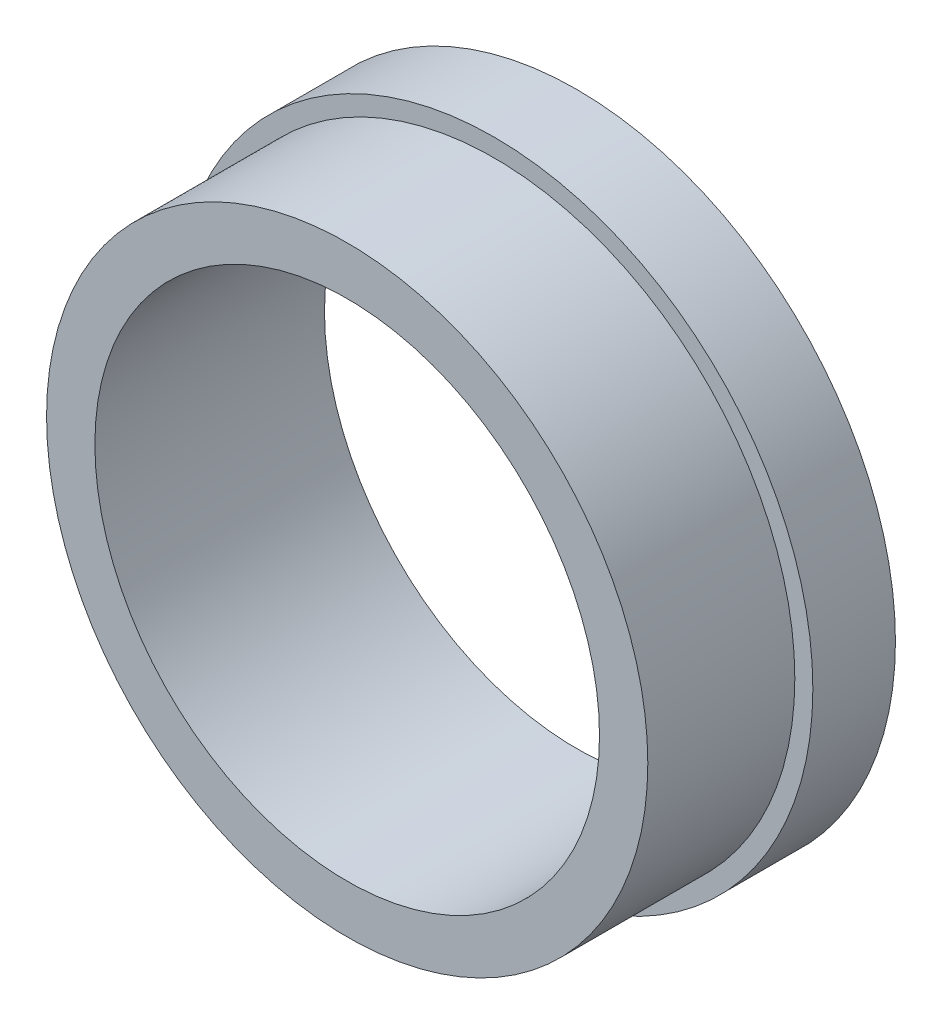
ISO-10303-21;
HEADER;
FILE_DESCRIPTION(('STEP AP214'),'2;1');
FILE_NAME('part.step','',(''),(''),'','','');
FILE_SCHEMA(('AUTOMOTIVE_DESIGN { 1 0 10303 214 1 1 1 1 }'));
ENDSEC;
DATA;
#1=APPLICATION_CONTEXT('core data for automotive mechanical design processes');
#2=APPLICATION_PROTOCOL_DEFINITION('international standard','automotive_design',2000,#1);
#3=PRODUCT_CONTEXT('',#1,'mechanical');
#4=PRODUCT('Part','Part','',(#3));
#5=PRODUCT_RELATED_PRODUCT_CATEGORY('part','',(#4));
#6=PRODUCT_DEFINITION_FORMATION('','',#4);
#7=PRODUCT_DEFINITION_CONTEXT('part definition',#1,'design');
#8=PRODUCT_DEFINITION('design','',#6,#7);
#9=PRODUCT_DEFINITION_SHAPE('','',#8);
#10=(LENGTH_UNIT() NAMED_UNIT(*) SI_UNIT(.MILLI.,.METRE.));
#11=(NAMED_UNIT(*) PLANE_ANGLE_UNIT() SI_UNIT($,.RADIAN.));
#12=(NAMED_UNIT(*) SI_UNIT($,.STERADIAN.) SOLID_ANGLE_UNIT());
#13=UNCERTAINTY_MEASURE_WITH_UNIT(LENGTH_MEASURE(1.E-05),#10,'distance_accuracy_value','');
#14=(GEOMETRIC_REPRESENTATION_CONTEXT(3) GLOBAL_UNCERTAINTY_ASSIGNED_CONTEXT((#13)) GLOBAL_UNIT_ASSIGNED_CONTEXT((#10,
#11,#12)) REPRESENTATION_CONTEXT('',''));
#15=CARTESIAN_POINT('',(0.,0.,0.));
#16=DIRECTION('',(0.,0.,1.));
#17=DIRECTION('',(1.,0.,0.));
#18=AXIS2_PLACEMENT_3D('',#15,#16,#17);
#19=CARTESIAN_POINT('',(0.,0.,35.306));
#20=DIRECTION('',(0.,0.,1.));
#21=DIRECTION('',(1.,0.,0.));
#22=AXIS2_PLACEMENT_3D('',#19,#20,#21);
#23=PLANE('',#22);
#24=CARTESIAN_POINT('',(0.,0.,35.306));
#25=DIRECTION('',(0.,0.,1.));
#26=DIRECTION('',(1.,0.,0.));
#27=AXIS2_PLACEMENT_3D('',#24,#25,#26);
#28=CIRCLE('',#27,38.7985);
#29=CARTESIAN_POINT('',(-38.7985,0.,35.306));
#30=VERTEX_POINT('',#29);
#31=EDGE_CURVE('E43',#30,#30,#28,.T.);
#32=ORIENTED_EDGE('',*,*,#31,.F.);
#33=EDGE_LOOP('',(#32));
#34=FACE_BOUND('',#33,.T.);
#35=CARTESIAN_POINT('',(0.,0.,35.306));
#36=DIRECTION('',(0.,0.,1.));
#37=DIRECTION('',(1.,0.,0.));
#38=AXIS2_PLACEMENT_3D('',#35,#36,#37);
#39=CIRCLE('',#38,46.228);
#40=CARTESIAN_POINT('',(46.228,0.,35.306));
#41=VERTEX_POINT('',#40);
#42=EDGE_CURVE('E54',#41,#41,#39,.T.);
#43=ORIENTED_EDGE('',*,*,#42,.T.);
#44=EDGE_LOOP('',(#43));
#45=FACE_BOUND('',#44,.T.);
#46=ADVANCED_FACE('F35',(#34,#45),#23,.T.);
#47=CARTESIAN_POINT('',(0.,0.,35.306));
#48=DIRECTION('',(0.,0.,-1.));
#49=DIRECTION('',(-1.,0.,0.));
#50=AXIS2_PLACEMENT_3D('',#47,#48,#49);
#51=CYLINDRICAL_SURFACE('',#50,49.);
#52=CARTESIAN_POINT('',(0.,0.,0.));
#53=DIRECTION('',(0.,0.,1.));
#54=DIRECTION('',(1.,0.,0.));
#55=AXIS2_PLACEMENT_3D('',#52,#53,#54);
#56=CIRCLE('',#55,49.);
#57=CARTESIAN_POINT('',(-49.,0.,0.));
#58=VERTEX_POINT('',#57);
#59=EDGE_CURVE('E11',#58,#58,#56,.T.);
#60=CARTESIAN_POINT('',(0.,0.,12.7));
#61=DIRECTION('',(0.,0.,1.));
#62=DIRECTION('',(1.,0.,0.));
#63=AXIS2_PLACEMENT_3D('',#60,#61,#62);
#64=CIRCLE('',#63,49.);
#65=CARTESIAN_POINT('',(-49.,0.,12.7));
#66=VERTEX_POINT('',#65);
#67=EDGE_CURVE('E39',#66,#66,#64,.T.);
#68=CARTESIAN_POINT('',(-49.,0.,0.));
#69=CARTESIAN_POINT('',(-49.,0.,0.132291666666666));
#70=CARTESIAN_POINT('',(-49.,0.,0.264583333333332));
#71=CARTESIAN_POINT('',(-49.,0.,0.529166666666666));
#72=CARTESIAN_POINT('',(-49.,0.,0.661458333333334));
#73=CARTESIAN_POINT('',(-49.,0.,0.926041666666669));
#74=CARTESIAN_POINT('',(-49.,0.,1.05833333333333));
#75=CARTESIAN_POINT('',(-49.,0.,1.32291666666667));
#76=CARTESIAN_POINT('',(-49.,0.,1.45520833333333));
#77=CARTESIAN_POINT('',(-49.,0.,1.71979166666667));
#78=CARTESIAN_POINT('',(-49.,0.,1.85208333333334));
#79=CARTESIAN_POINT('',(-49.,0.,2.11666666666667));
#80=CARTESIAN_POINT('',(-49.,0.,2.24895833333334));
#81=CARTESIAN_POINT('',(-49.,0.,2.51354166666667));
#82=CARTESIAN_POINT('',(-49.,0.,2.64583333333333));
#83=CARTESIAN_POINT('',(-49.,0.,2.91041666666667));
#84=CARTESIAN_POINT('',(-49.,0.,3.04270833333333));
#85=CARTESIAN_POINT('',(-49.,0.,3.30729166666667));
#86=CARTESIAN_POINT('',(-49.,0.,3.43958333333333));
#87=CARTESIAN_POINT('',(-49.,0.,3.70416666666667));
#88=CARTESIAN_POINT('',(-49.,0.,3.83645833333333));
#89=CARTESIAN_POINT('',(-49.,0.,4.10104166666667));
#90=CARTESIAN_POINT('',(-49.,0.,4.23333333333333));
#91=CARTESIAN_POINT('',(-49.,0.,4.49791666666667));
#92=CARTESIAN_POINT('',(-49.,0.,4.63020833333333));
#93=CARTESIAN_POINT('',(-49.,0.,4.89479166666667));
#94=CARTESIAN_POINT('',(-49.,0.,5.02708333333333));
#95=CARTESIAN_POINT('',(-49.,0.,5.29166666666666));
#96=CARTESIAN_POINT('',(-49.,0.,5.42395833333333));
#97=CARTESIAN_POINT('',(-49.,0.,5.68854166666667));
#98=CARTESIAN_POINT('',(-49.,0.,5.82083333333333));
#99=CARTESIAN_POINT('',(-49.,0.,6.08541666666667));
#100=CARTESIAN_POINT('',(-49.,0.,6.21770833333333));
#101=CARTESIAN_POINT('',(-49.,0.,6.48229166666666));
#102=CARTESIAN_POINT('',(-49.,0.,6.61458333333333));
#103=CARTESIAN_POINT('',(-49.,0.,6.87916666666666));
#104=CARTESIAN_POINT('',(-49.,0.,7.01145833333333));
#105=CARTESIAN_POINT('',(-49.,0.,7.27604166666666));
#106=CARTESIAN_POINT('',(-49.,0.,7.40833333333333));
#107=CARTESIAN_POINT('',(-49.,0.,7.67291666666666));
#108=CARTESIAN_POINT('',(-49.,0.,7.80520833333333));
#109=CARTESIAN_POINT('',(-49.,0.,8.06979166666666));
#110=CARTESIAN_POINT('',(-49.,0.,8.20208333333333));
#111=CARTESIAN_POINT('',(-49.,0.,8.46666666666667));
#112=CARTESIAN_POINT('',(-49.,0.,8.59895833333333));
#113=CARTESIAN_POINT('',(-49.,0.,8.86354166666666));
#114=CARTESIAN_POINT('',(-49.,0.,8.99583333333333));
#115=CARTESIAN_POINT('',(-49.,0.,9.26041666666666));
#116=CARTESIAN_POINT('',(-49.,0.,9.39270833333333));
#117=CARTESIAN_POINT('',(-49.,0.,9.65729166666667));
#118=CARTESIAN_POINT('',(-49.,0.,9.78958333333333));
#119=CARTESIAN_POINT('',(-49.,0.,10.0541666666667));
#120=CARTESIAN_POINT('',(-49.,0.,10.1864583333333));
#121=CARTESIAN_POINT('',(-49.,0.,10.4510416666667));
#122=CARTESIAN_POINT('',(-49.,0.,10.5833333333333));
#123=CARTESIAN_POINT('',(-49.,0.,10.8479166666667));
#124=CARTESIAN_POINT('',(-49.,0.,10.9802083333333));
#125=CARTESIAN_POINT('',(-49.,0.,11.2447916666667));
#126=CARTESIAN_POINT('',(-49.,0.,11.3770833333333));
#127=CARTESIAN_POINT('',(-49.,0.,11.6416666666667));
#128=CARTESIAN_POINT('',(-49.,0.,11.7739583333333));
#129=CARTESIAN_POINT('',(-49.,0.,12.0385416666667));
#130=CARTESIAN_POINT('',(-49.,0.,12.1708333333333));
#131=CARTESIAN_POINT('',(-49.,0.,12.4354166666667));
#132=CARTESIAN_POINT('',(-49.,0.,12.5677083333333));
#133=CARTESIAN_POINT('',(-49.,0.,12.7));
#134=B_SPLINE_CURVE_WITH_KNOTS('',3,(#68,#69,#70,#71,#72,#73,#74,#75,#76,#77,#78,#79,#80,#81,
#82,#83,#84,#85,#86,#87,#88,#89,#90,#91,#92,#93,#94,#95,#96,#97,#98,#99,#100,#101,#102,#103,
#104,#105,#106,#107,#108,#109,#110,#111,#112,#113,#114,#115,#116,#117,#118,#119,#120,#121,#122,
#123,#124,#125,#126,#127,#128,#129,#130,#131,#132,#133),.UNSPECIFIED.,.F.,.F.,(4,2,2,2,2,2,2,2,
2,2,2,2,2,2,2,2,2,2,2,2,2,2,2,2,2,2,2,2,2,2,2,2,4),(0.,0.396874999999998,0.793750000000003,
1.190625,1.5875,1.984375,2.38125,2.778125,3.175,3.571875,3.96875,4.365625,4.7625,5.159375,
5.55625,5.953125,6.35,6.746875,7.14375,7.540625,7.9375,8.334375,8.73125,9.128125,9.525,9.921875,
10.31875,10.715625,11.1125,11.509375,11.90625,12.303125,12.7),.UNSPECIFIED.);
#135=EDGE_CURVE('BSEAM37',#58,#66,#134,.T.);
#136=ORIENTED_EDGE('',*,*,#59,.T.);
#137=ORIENTED_EDGE('',*,*,#67,.F.);
#138=ORIENTED_EDGE('',*,*,#135,.T.);
#139=ORIENTED_EDGE('',*,*,#135,.F.);
#140=EDGE_LOOP('',(#136,#138,#137,#139));
#141=FACE_BOUND('',#140,.T.);
#142=ADVANCED_FACE('F37',(#141),#51,.T.);
#143=CARTESIAN_POINT('',(0.,0.,0.));
#144=DIRECTION('',(0.,0.,1.));
#145=DIRECTION('',(1.,0.,0.));
#146=AXIS2_PLACEMENT_3D('',#143,#144,#145);
#147=PLANE('',#146);
#148=ORIENTED_EDGE('',*,*,#59,.F.);
#149=EDGE_LOOP('',(#148));
#150=FACE_BOUND('',#149,.T.);
#151=CARTESIAN_POINT('',(0.,0.,0.));
#152=DIRECTION('',(0.,0.,1.));
#153=DIRECTION('',(1.,0.,0.));
#154=AXIS2_PLACEMENT_3D('',#151,#152,#153);
#155=CIRCLE('',#154,38.7985);
#156=CARTESIAN_POINT('',(-38.7985,0.,0.));
#157=VERTEX_POINT('',#156);
#158=EDGE_CURVE('E48',#157,#157,#155,.T.);
#159=ORIENTED_EDGE('',*,*,#158,.T.);
#160=EDGE_LOOP('',(#159));
#161=FACE_BOUND('',#160,.T.);
#162=ADVANCED_FACE('F69',(#150,#161),#147,.F.);
#163=CARTESIAN_POINT('',(0.,0.,35.306));
#164=DIRECTION('',(0.,0.,-1.));
#165=DIRECTION('',(-1.,0.,0.));
#166=AXIS2_PLACEMENT_3D('',#163,#164,#165);
#167=CYLINDRICAL_SURFACE('',#166,38.7985);
#168=CARTESIAN_POINT('',(-38.7985,0.,35.306));
#169=CARTESIAN_POINT('',(-38.7985,0.,34.9382291666667));
#170=CARTESIAN_POINT('',(-38.7985,0.,34.5704583333333));
#171=CARTESIAN_POINT('',(-38.7985,0.,33.8349166666667));
#172=CARTESIAN_POINT('',(-38.7985,0.,33.4671458333333));
#173=CARTESIAN_POINT('',(-38.7985,0.,32.7316041666667));
#174=CARTESIAN_POINT('',(-38.7985,0.,32.3638333333333));
#175=CARTESIAN_POINT('',(-38.7985,0.,31.6282916666667));
#176=CARTESIAN_POINT('',(-38.7985,0.,31.2605208333333));
#177=CARTESIAN_POINT('',(-38.7985,0.,30.5249791666667));
#178=CARTESIAN_POINT('',(-38.7985,0.,30.1572083333333));
#179=CARTESIAN_POINT('',(-38.7985,0.,29.4216666666667));
#180=CARTESIAN_POINT('',(-38.7985,0.,29.0538958333333));
#181=CARTESIAN_POINT('',(-38.7985,0.,28.3183541666667));
#182=CARTESIAN_POINT('',(-38.7985,0.,27.9505833333333));
#183=CARTESIAN_POINT('',(-38.7985,0.,27.2150416666667));
#184=CARTESIAN_POINT('',(-38.7985,0.,26.8472708333333));
#185=CARTESIAN_POINT('',(-38.7985,0.,26.1117291666667));
#186=CARTESIAN_POINT('',(-38.7985,0.,25.7439583333333));
#187=CARTESIAN_POINT('',(-38.7985,0.,25.0084166666667));
#188=CARTESIAN_POINT('',(-38.7985,0.,24.6406458333333));
#189=CARTESIAN_POINT('',(-38.7985,0.,23.9051041666667));
#190=CARTESIAN_POINT('',(-38.7985,0.,23.5373333333333));
#191=CARTESIAN_POINT('',(-38.7985,0.,22.8017916666667));
#192=CARTESIAN_POINT('',(-38.7985,0.,22.4340208333333));
#193=CARTESIAN_POINT('',(-38.7985,0.,21.6984791666667));
#194=CARTESIAN_POINT('',(-38.7985,0.,21.3307083333333));
#195=CARTESIAN_POINT('',(-38.7985,0.,20.5951666666667));
#196=CARTESIAN_POINT('',(-38.7985,0.,20.2273958333333));
#197=CARTESIAN_POINT('',(-38.7985,0.,19.4918541666667));
#198=CARTESIAN_POINT('',(-38.7985,0.,19.1240833333333));
#199=CARTESIAN_POINT('',(-38.7985,0.,18.3885416666667));
#200=CARTESIAN_POINT('',(-38.7985,0.,18.0207708333333));
#201=CARTESIAN_POINT('',(-38.7985,0.,17.2852291666667));
#202=CARTESIAN_POINT('',(-38.7985,0.,16.9174583333333));
#203=CARTESIAN_POINT('',(-38.7985,0.,16.1819166666667));
#204=CARTESIAN_POINT('',(-38.7985,0.,15.8141458333333));
#205=CARTESIAN_POINT('',(-38.7985,0.,15.0786041666667));
#206=CARTESIAN_POINT('',(-38.7985,0.,14.7108333333333));
#207=CARTESIAN_POINT('',(-38.7985,0.,13.9752916666667));
#208=CARTESIAN_POINT('',(-38.7985,0.,13.6075208333333));
#209=CARTESIAN_POINT('',(-38.7985,0.,12.8719791666667));
#210=CARTESIAN_POINT('',(-38.7985,0.,12.5042083333333));
#211=CARTESIAN_POINT('',(-38.7985,0.,11.7686666666667));
#212=CARTESIAN_POINT('',(-38.7985,0.,11.4008958333333));
#213=CARTESIAN_POINT('',(-38.7985,0.,10.6653541666667));
#214=CARTESIAN_POINT('',(-38.7985,0.,10.2975833333333));
#215=CARTESIAN_POINT('',(-38.7985,0.,9.56204166666667));
#216=CARTESIAN_POINT('',(-38.7985,0.,9.19427083333333));
#217=CARTESIAN_POINT('',(-38.7985,0.,8.45872916666667));
#218=CARTESIAN_POINT('',(-38.7985,0.,8.09095833333333));
#219=CARTESIAN_POINT('',(-38.7985,0.,7.35541666666667));
#220=CARTESIAN_POINT('',(-38.7985,0.,6.98764583333333));
#221=CARTESIAN_POINT('',(-38.7985,0.,6.25210416666667));
#222=CARTESIAN_POINT('',(-38.7985,0.,5.88433333333333));
#223=CARTESIAN_POINT('',(-38.7985,0.,5.14879166666667));
#224=CARTESIAN_POINT('',(-38.7985,0.,4.78102083333333));
#225=CARTESIAN_POINT('',(-38.7985,0.,4.04547916666667));
#226=CARTESIAN_POINT('',(-38.7985,0.,3.67770833333333));
#227=CARTESIAN_POINT('',(-38.7985,0.,2.94216666666666));
#228=CARTESIAN_POINT('',(-38.7985,0.,2.57439583333333));
#229=CARTESIAN_POINT('',(-38.7985,0.,1.83885416666667));
#230=CARTESIAN_POINT('',(-38.7985,0.,1.47108333333333));
#231=CARTESIAN_POINT('',(-38.7985,0.,0.735541666666668));
#232=CARTESIAN_POINT('',(-38.7985,0.,0.367770833333334));
#233=CARTESIAN_POINT('',(-38.7985,0.,0.));
#234=B_SPLINE_CURVE_WITH_KNOTS('',3,(#168,#169,#170,#171,#172,#173,#174,#175,#176,#177,#178,
#179,#180,#181,#182,#183,#184,#185,#186,#187,#188,#189,#190,#191,#192,#193,#194,#195,#196,#197,
#198,#199,#200,#201,#202,#203,#204,#205,#206,#207,#208,#209,#210,#211,#212,#213,#214,#215,#216,
#217,#218,#219,#220,#221,#222,#223,#224,#225,#226,#227,#228,#229,#230,#231,#232,#233),
.UNSPECIFIED.,.F.,.F.,(4,2,2,2,2,2,2,2,2,2,2,2,2,2,2,2,2,2,2,2,2,2,2,2,2,2,2,2,2,2,2,2,4),(0.,
1.1033125,2.206625,3.3099375,4.41324999999999,5.5165625,6.61987499999999,7.7231875,
8.82649999999999,9.9298125,11.033125,12.1364375,13.23975,14.3430625,15.446375,16.5496875,17.653,
18.7563125,19.859625,20.9629375,22.06625,23.1695625,24.272875,25.3761875,26.4795,27.5828125,
28.686125,29.7894375,30.89275,31.9960625,33.099375,34.2026875,35.306),.UNSPECIFIED.);
#235=EDGE_CURVE('BSEAM74',#30,#157,#234,.T.);
#236=ORIENTED_EDGE('',*,*,#31,.T.);
#237=ORIENTED_EDGE('',*,*,#158,.F.);
#238=ORIENTED_EDGE('',*,*,#235,.T.);
#239=ORIENTED_EDGE('',*,*,#235,.F.);
#240=EDGE_LOOP('',(#236,#238,#237,#239));
#241=FACE_BOUND('',#240,.T.);
#242=ADVANCED_FACE('F74',(#241),#167,.F.);
#243=CARTESIAN_POINT('',(0.,0.,12.7));
#244=DIRECTION('',(0.,0.,1.));
#245=DIRECTION('',(1.,0.,0.));
#246=AXIS2_PLACEMENT_3D('',#243,#244,#245);
#247=PLANE('',#246);
#248=CARTESIAN_POINT('',(0.,0.,12.7));
#249=DIRECTION('',(0.,0.,1.));
#250=DIRECTION('',(1.,0.,0.));
#251=AXIS2_PLACEMENT_3D('',#248,#249,#250);
#252=CIRCLE('',#251,46.228);
#253=CARTESIAN_POINT('',(46.228,0.,12.7));
#254=VERTEX_POINT('',#253);
#255=EDGE_CURVE('E58',#254,#254,#252,.T.);
#256=ORIENTED_EDGE('',*,*,#255,.F.);
#257=EDGE_LOOP('',(#256));
#258=FACE_BOUND('',#257,.T.);
#259=ORIENTED_EDGE('',*,*,#67,.T.);
#260=EDGE_LOOP('',(#259));
#261=FACE_BOUND('',#260,.T.);
#262=ADVANCED_FACE('F66',(#258,#261),#247,.T.);
#263=CARTESIAN_POINT('',(0.,0.,12.7));
#264=DIRECTION('',(0.,0.,1.));
#265=DIRECTION('',(1.,0.,0.));
#266=AXIS2_PLACEMENT_3D('',#263,#264,#265);
#267=CYLINDRICAL_SURFACE('',#266,46.228);
#268=CARTESIAN_POINT('',(46.228,0.,12.7));
#269=CARTESIAN_POINT('',(46.228,0.,12.9354791666667));
#270=CARTESIAN_POINT('',(46.228,0.,13.1709583333333));
#271=CARTESIAN_POINT('',(46.228,0.,13.6419166666667));
#272=CARTESIAN_POINT('',(46.228,0.,13.8773958333333));
#273=CARTESIAN_POINT('',(46.228,0.,14.3483541666667));
#274=CARTESIAN_POINT('',(46.228,0.,14.5838333333333));
#275=CARTESIAN_POINT('',(46.228,0.,15.0547916666667));
#276=CARTESIAN_POINT('',(46.228,0.,15.2902708333333));
#277=CARTESIAN_POINT('',(46.228,0.,15.7612291666667));
#278=CARTESIAN_POINT('',(46.228,0.,15.9967083333333));
#279=CARTESIAN_POINT('',(46.228,0.,16.4676666666667));
#280=CARTESIAN_POINT('',(46.228,0.,16.7031458333333));
#281=CARTESIAN_POINT('',(46.228,0.,17.1741041666667));
#282=CARTESIAN_POINT('',(46.228,0.,17.4095833333333));
#283=CARTESIAN_POINT('',(46.228,0.,17.8805416666667));
#284=CARTESIAN_POINT('',(46.228,0.,18.1160208333333));
#285=CARTESIAN_POINT('',(46.228,0.,18.5869791666667));
#286=CARTESIAN_POINT('',(46.228,0.,18.8224583333333));
#287=CARTESIAN_POINT('',(46.228,0.,19.2934166666667));
#288=CARTESIAN_POINT('',(46.228,0.,19.5288958333333));
#289=CARTESIAN_POINT('',(46.228,0.,19.9998541666667));
#290=CARTESIAN_POINT('',(46.228,0.,20.2353333333333));
#291=CARTESIAN_POINT('',(46.228,0.,20.7062916666667));
#292=CARTESIAN_POINT('',(46.228,0.,20.9417708333333));
#293=CARTESIAN_POINT('',(46.228,0.,21.4127291666667));
#294=CARTESIAN_POINT('',(46.228,0.,21.6482083333333));
#295=CARTESIAN_POINT('',(46.228,0.,22.1191666666667));
#296=CARTESIAN_POINT('',(46.228,0.,22.3546458333333));
#297=CARTESIAN_POINT('',(46.228,0.,22.8256041666667));
#298=CARTESIAN_POINT('',(46.228,0.,23.0610833333333));
#299=CARTESIAN_POINT('',(46.228,0.,23.5320416666667));
#300=CARTESIAN_POINT('',(46.228,0.,23.7675208333333));
#301=CARTESIAN_POINT('',(46.228,0.,24.2384791666667));
#302=CARTESIAN_POINT('',(46.228,0.,24.4739583333333));
#303=CARTESIAN_POINT('',(46.228,0.,24.9449166666667));
#304=CARTESIAN_POINT('',(46.228,0.,25.1803958333333));
#305=CARTESIAN_POINT('',(46.228,0.,25.6513541666667));
#306=CARTESIAN_POINT('',(46.228,0.,25.8868333333333));
#307=CARTESIAN_POINT('',(46.228,0.,26.3577916666667));
#308=CARTESIAN_POINT('',(46.228,0.,26.5932708333333));
#309=CARTESIAN_POINT('',(46.228,0.,27.0642291666667));
#310=CARTESIAN_POINT('',(46.228,0.,27.2997083333333));
#311=CARTESIAN_POINT('',(46.228,0.,27.7706666666667));
#312=CARTESIAN_POINT('',(46.228,0.,28.0061458333333));
#313=CARTESIAN_POINT('',(46.228,0.,28.4771041666667));
#314=CARTESIAN_POINT('',(46.228,0.,28.7125833333333));
#315=CARTESIAN_POINT('',(46.228,0.,29.1835416666667));
#316=CARTESIAN_POINT('',(46.228,0.,29.4190208333333));
#317=CARTESIAN_POINT('',(46.228,0.,29.8899791666667));
#318=CARTESIAN_POINT('',(46.228,0.,30.1254583333333));
#319=CARTESIAN_POINT('',(46.228,0.,30.5964166666667));
#320=CARTESIAN_POINT('',(46.228,0.,30.8318958333333));
#321=CARTESIAN_POINT('',(46.228,0.,31.3028541666667));
#322=CARTESIAN_POINT('',(46.228,0.,31.5383333333333));
#323=CARTESIAN_POINT('',(46.228,0.,32.0092916666667));
#324=CARTESIAN_POINT('',(46.228,0.,32.2447708333333));
#325=CARTESIAN_POINT('',(46.228,0.,32.7157291666667));
#326=CARTESIAN_POINT('',(46.228,0.,32.9512083333333));
#327=CARTESIAN_POINT('',(46.228,0.,33.4221666666667));
#328=CARTESIAN_POINT('',(46.228,0.,33.6576458333333));
#329=CARTESIAN_POINT('',(46.228,0.,34.1286041666667));
#330=CARTESIAN_POINT('',(46.228,0.,34.3640833333333));
#331=CARTESIAN_POINT('',(46.228,0.,34.8350416666667));
#332=CARTESIAN_POINT('',(46.228,0.,35.0705208333333));
#333=CARTESIAN_POINT('',(46.228,0.,35.306));
#334=B_SPLINE_CURVE_WITH_KNOTS('',3,(#268,#269,#270,#271,#272,#273,#274,#275,#276,#277,#278,
#279,#280,#281,#282,#283,#284,#285,#286,#287,#288,#289,#290,#291,#292,#293,#294,#295,#296,#297,
#298,#299,#300,#301,#302,#303,#304,#305,#306,#307,#308,#309,#310,#311,#312,#313,#314,#315,#316,
#317,#318,#319,#320,#321,#322,#323,#324,#325,#326,#327,#328,#329,#330,#331,#332,#333),
.UNSPECIFIED.,.F.,.F.,(4,2,2,2,2,2,2,2,2,2,2,2,2,2,2,2,2,2,2,2,2,2,2,2,2,2,2,2,2,2,2,2,4),(0.,
0.7064375,1.412875,2.1193125,2.82575,3.5321875,4.238625,4.9450625,5.6515,6.3579375,7.064375,
7.7708125,8.47725,9.1836875,9.890125,10.5965625,11.303,12.0094375,12.715875,13.4223125,14.12875,
14.8351875,15.541625,16.2480625,16.9545,17.6609375,18.367375,19.0738125,19.78025,20.4866875,
21.193125,21.8995625,22.606),.UNSPECIFIED.);
#335=EDGE_CURVE('BSEAM88',#254,#41,#334,.T.);
#336=ORIENTED_EDGE('',*,*,#255,.T.);
#337=ORIENTED_EDGE('',*,*,#42,.F.);
#338=ORIENTED_EDGE('',*,*,#335,.T.);
#339=ORIENTED_EDGE('',*,*,#335,.F.);
#340=EDGE_LOOP('',(#336,#338,#337,#339));
#341=FACE_BOUND('',#340,.T.);
#342=ADVANCED_FACE('F88',(#341),#267,.T.);
#343=CLOSED_SHELL('',(#46,#142,#162,#242,#262,#342));
#344=MANIFOLD_SOLID_BREP('B2',#343);
#345=ADVANCED_BREP_SHAPE_REPRESENTATION('',(#18,#344),#14);
#346=SHAPE_DEFINITION_REPRESENTATION(#9,#345);
ENDSEC;
END-ISO-10303-21;
